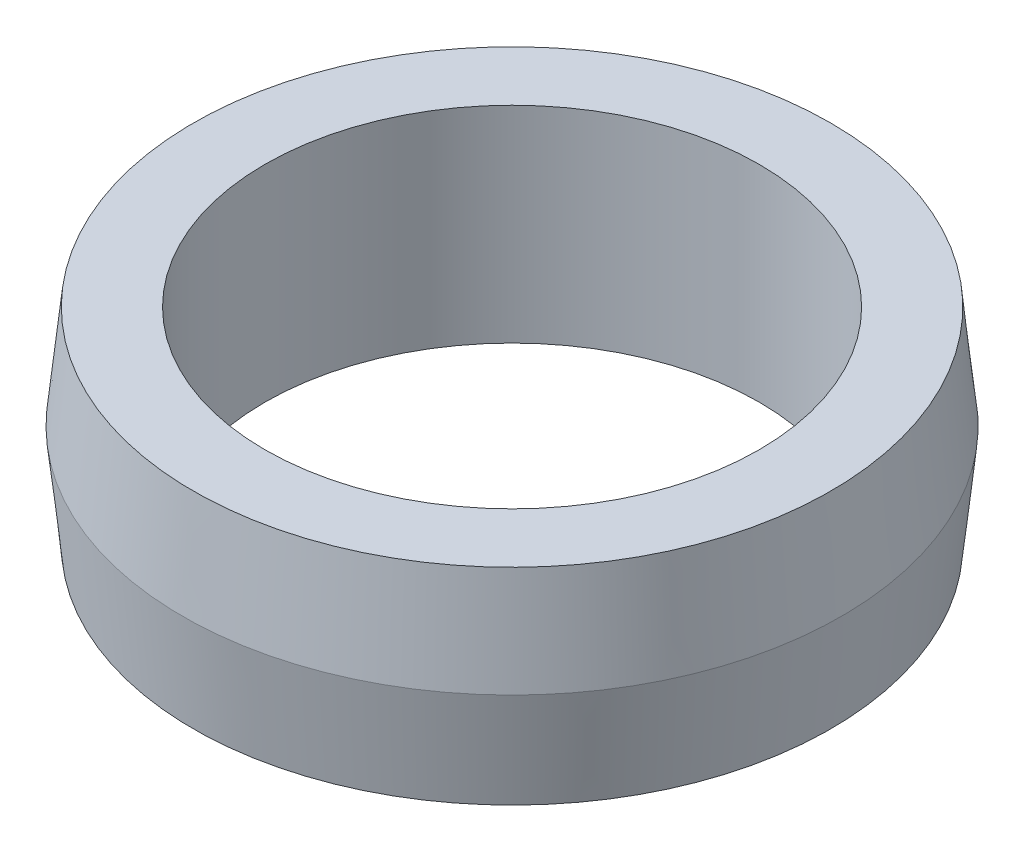
ISO-10303-21;
HEADER;
FILE_DESCRIPTION(('STEP AP214'),'2;1');
FILE_NAME('part.step','',(''),(''),'','','');
FILE_SCHEMA(('AUTOMOTIVE_DESIGN { 1 0 10303 214 1 1 1 1 }'));
ENDSEC;
DATA;
#1=APPLICATION_CONTEXT('core data for automotive mechanical design processes');
#2=APPLICATION_PROTOCOL_DEFINITION('international standard','automotive_design',2000,#1);
#3=PRODUCT_CONTEXT('',#1,'mechanical');
#4=PRODUCT('Part','Part','',(#3));
#5=PRODUCT_RELATED_PRODUCT_CATEGORY('part','',(#4));
#6=PRODUCT_DEFINITION_FORMATION('','',#4);
#7=PRODUCT_DEFINITION_CONTEXT('part definition',#1,'design');
#8=PRODUCT_DEFINITION('design','',#6,#7);
#9=PRODUCT_DEFINITION_SHAPE('','',#8);
#10=(LENGTH_UNIT() NAMED_UNIT(*) SI_UNIT(.MILLI.,.METRE.));
#11=(NAMED_UNIT(*) PLANE_ANGLE_UNIT() SI_UNIT($,.RADIAN.));
#12=(NAMED_UNIT(*) SI_UNIT($,.STERADIAN.) SOLID_ANGLE_UNIT());
#13=UNCERTAINTY_MEASURE_WITH_UNIT(LENGTH_MEASURE(1.E-05),#10,'distance_accuracy_value','');
#14=(GEOMETRIC_REPRESENTATION_CONTEXT(3) GLOBAL_UNCERTAINTY_ASSIGNED_CONTEXT((#13)) GLOBAL_UNIT_ASSIGNED_CONTEXT((#10,
#11,#12)) REPRESENTATION_CONTEXT('',''));
#15=CARTESIAN_POINT('',(0.,0.,0.));
#16=DIRECTION('',(0.,0.,1.));
#17=DIRECTION('',(1.,0.,0.));
#18=AXIS2_PLACEMENT_3D('',#15,#16,#17);
#19=CARTESIAN_POINT('',(0.,31.75,0.));
#20=DIRECTION('',(0.,1.,0.));
#21=DIRECTION('',(0.,0.,1.));
#22=AXIS2_PLACEMENT_3D('',#19,#20,#21);
#23=PLANE('',#22);
#24=CARTESIAN_POINT('',(0.,31.75,0.));
#25=DIRECTION('',(0.,1.,0.));
#26=DIRECTION('',(0.,0.,1.));
#27=AXIS2_PLACEMENT_3D('',#24,#25,#26);
#28=CIRCLE('',#27,38.1);
#29=CARTESIAN_POINT('',(0.,31.75,38.1));
#30=VERTEX_POINT('',#29);
#31=EDGE_CURVE('E10',#30,#30,#28,.T.);
#32=ORIENTED_EDGE('',*,*,#31,.F.);
#33=EDGE_LOOP('',(#32));
#34=FACE_BOUND('',#33,.T.);
#35=CARTESIAN_POINT('',(0.,31.75,0.));
#36=DIRECTION('',(0.,-1.,0.));
#37=DIRECTION('',(0.,0.,-1.));
#38=AXIS2_PLACEMENT_3D('',#35,#36,#37);
#39=CIRCLE('',#38,49.1314702651575);
#40=CARTESIAN_POINT('',(0.,31.75,-49.1314702651575));
#41=VERTEX_POINT('',#40);
#42=EDGE_CURVE('E47',#41,#41,#39,.T.);
#43=ORIENTED_EDGE('',*,*,#42,.F.);
#44=EDGE_LOOP('',(#43));
#45=FACE_BOUND('',#44,.T.);
#46=ADVANCED_FACE('F32',(#34,#45),#23,.T.);
#47=CARTESIAN_POINT('',(0.,0.,0.));
#48=DIRECTION('',(0.,1.,0.));
#49=DIRECTION('',(0.,0.,1.));
#50=AXIS2_PLACEMENT_3D('',#47,#48,#49);
#51=PLANE('',#50);
#52=CARTESIAN_POINT('',(0.,0.,0.));
#53=DIRECTION('',(0.,1.,0.));
#54=DIRECTION('',(0.,0.,1.));
#55=AXIS2_PLACEMENT_3D('',#52,#53,#54);
#56=CIRCLE('',#55,38.1);
#57=CARTESIAN_POINT('',(0.,0.,38.1));
#58=VERTEX_POINT('',#57);
#59=EDGE_CURVE('E36',#58,#58,#56,.T.);
#60=ORIENTED_EDGE('',*,*,#59,.T.);
#61=EDGE_LOOP('',(#60));
#62=FACE_BOUND('',#61,.T.);
#63=CARTESIAN_POINT('',(0.,0.,0.));
#64=DIRECTION('',(0.,-1.,0.));
#65=DIRECTION('',(0.,0.,-1.));
#66=AXIS2_PLACEMENT_3D('',#63,#64,#65);
#67=CIRCLE('',#66,49.1314702651575);
#68=CARTESIAN_POINT('',(0.,0.,-49.1314702651575));
#69=VERTEX_POINT('',#68);
#70=EDGE_CURVE('E50',#69,#69,#67,.T.);
#71=ORIENTED_EDGE('',*,*,#70,.T.);
#72=EDGE_LOOP('',(#71));
#73=FACE_BOUND('',#72,.T.);
#74=ADVANCED_FACE('F34',(#62,#73),#51,.F.);
#75=CARTESIAN_POINT('',(0.,31.75,0.));
#76=DIRECTION('',(0.,-1.,0.));
#77=DIRECTION('',(0.,0.,-1.));
#78=AXIS2_PLACEMENT_3D('',#75,#76,#77);
#79=CYLINDRICAL_SURFACE('',#78,38.1);
#80=ORIENTED_EDGE('',*,*,#31,.T.);
#81=EDGE_LOOP('',(#80));
#82=FACE_BOUND('',#81,.T.);
#83=ORIENTED_EDGE('',*,*,#59,.F.);
#84=EDGE_LOOP('',(#83));
#85=FACE_BOUND('',#84,.T.);
#86=ADVANCED_FACE('F58',(#82,#85),#79,.F.);
#87=CARTESIAN_POINT('',(0.,0.,0.));
#88=DIRECTION('',(0.,1.,0.));
#89=DIRECTION('',(0.,0.,1.));
#90=AXIS2_PLACEMENT_3D('',#87,#88,#89);
#91=CONICAL_SURFACE('',#90,49.1314702651575,0.104719755119653);
#92=CARTESIAN_POINT('',(0.,15.875,0.));
#93=DIRECTION('',(0.,-1.,0.));
#94=DIRECTION('',(0.,0.,-1.));
#95=AXIS2_PLACEMENT_3D('',#92,#93,#94);
#96=CIRCLE('',#95,50.8);
#97=CARTESIAN_POINT('',(0.,15.875,-50.8));
#98=VERTEX_POINT('',#97);
#99=EDGE_CURVE('E43',#98,#98,#96,.T.);
#100=ORIENTED_EDGE('',*,*,#99,.T.);
#101=EDGE_LOOP('',(#100));
#102=FACE_BOUND('',#101,.T.);
#103=ORIENTED_EDGE('',*,*,#70,.F.);
#104=EDGE_LOOP('',(#103));
#105=FACE_BOUND('',#104,.T.);
#106=ADVANCED_FACE('F55',(#102,#105),#91,.T.);
#107=CARTESIAN_POINT('',(0.,15.875,0.));
#108=DIRECTION('',(0.,-1.,0.));
#109=DIRECTION('',(0.,0.,-1.));
#110=AXIS2_PLACEMENT_3D('',#107,#108,#109);
#111=CONICAL_SURFACE('',#110,50.8,0.104719755119653);
#112=ORIENTED_EDGE('',*,*,#42,.T.);
#113=EDGE_LOOP('',(#112));
#114=FACE_BOUND('',#113,.T.);
#115=ORIENTED_EDGE('',*,*,#99,.F.);
#116=EDGE_LOOP('',(#115));
#117=FACE_BOUND('',#116,.T.);
#118=ADVANCED_FACE('F57',(#114,#117),#111,.T.);
#119=CLOSED_SHELL('',(#46,#74,#86,#106,#118));
#120=MANIFOLD_SOLID_BREP('B2',#119);
#121=ADVANCED_BREP_SHAPE_REPRESENTATION('',(#18,#120),#14);
#122=SHAPE_DEFINITION_REPRESENTATION(#9,#121);
ENDSEC;
END-ISO-10303-21;
